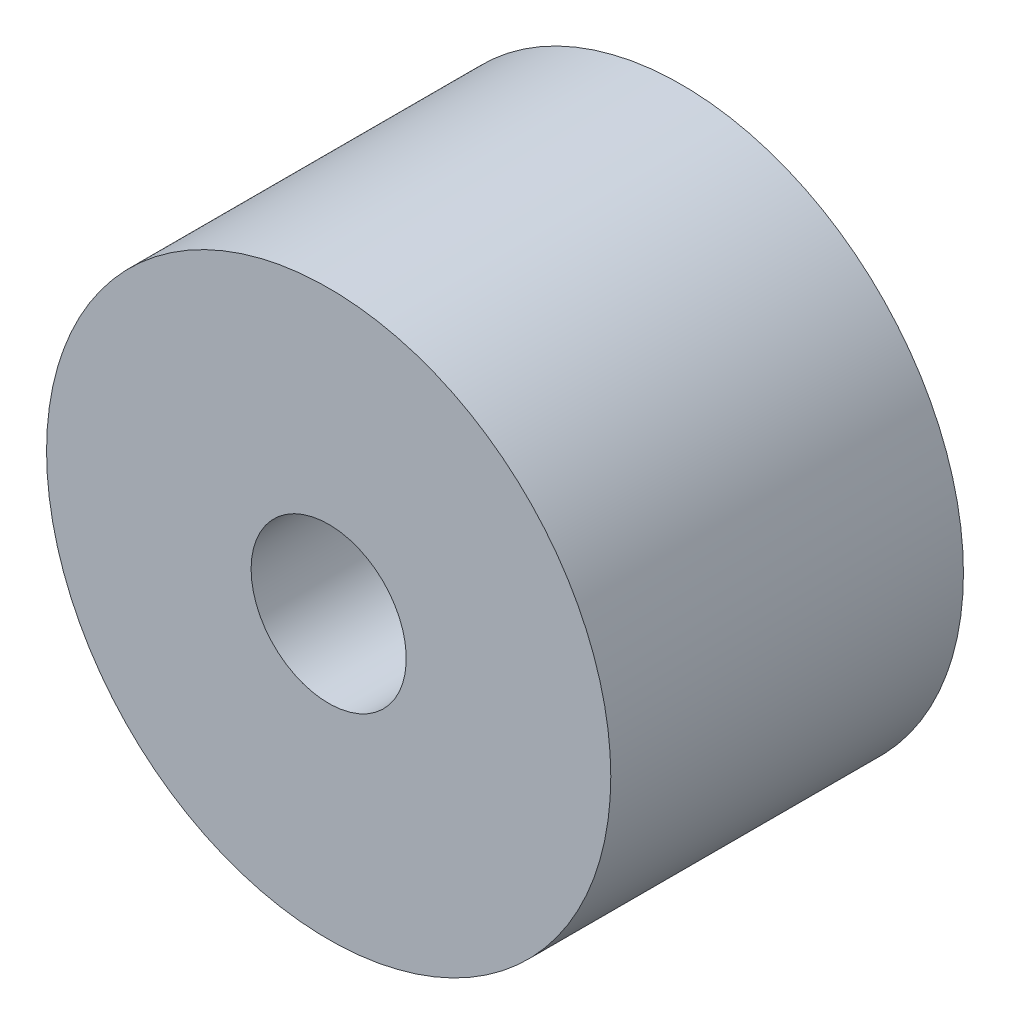
ISO-10303-21;
HEADER;
FILE_DESCRIPTION(('STEP AP214'),'2;1');
FILE_NAME('part.step','',(''),(''),'','','');
FILE_SCHEMA(('AUTOMOTIVE_DESIGN { 1 0 10303 214 1 1 1 1 }'));
ENDSEC;
DATA;
#1=APPLICATION_CONTEXT('core data for automotive mechanical design processes');
#2=APPLICATION_PROTOCOL_DEFINITION('international standard','automotive_design',2000,#1);
#3=PRODUCT_CONTEXT('',#1,'mechanical');
#4=PRODUCT('Part','Part','',(#3));
#5=PRODUCT_RELATED_PRODUCT_CATEGORY('part','',(#4));
#6=PRODUCT_DEFINITION_FORMATION('','',#4);
#7=PRODUCT_DEFINITION_CONTEXT('part definition',#1,'design');
#8=PRODUCT_DEFINITION('design','',#6,#7);
#9=PRODUCT_DEFINITION_SHAPE('','',#8);
#10=(LENGTH_UNIT() NAMED_UNIT(*) SI_UNIT(.MILLI.,.METRE.));
#11=(NAMED_UNIT(*) PLANE_ANGLE_UNIT() SI_UNIT($,.RADIAN.));
#12=(NAMED_UNIT(*) SI_UNIT($,.STERADIAN.) SOLID_ANGLE_UNIT());
#13=UNCERTAINTY_MEASURE_WITH_UNIT(LENGTH_MEASURE(1.E-05),#10,'distance_accuracy_value','');
#14=(GEOMETRIC_REPRESENTATION_CONTEXT(3) GLOBAL_UNCERTAINTY_ASSIGNED_CONTEXT((#13)) GLOBAL_UNIT_ASSIGNED_CONTEXT((#10,
#11,#12)) REPRESENTATION_CONTEXT('',''));
#15=CARTESIAN_POINT('',(0.,0.,0.));
#16=DIRECTION('',(0.,0.,1.));
#17=DIRECTION('',(1.,0.,0.));
#18=AXIS2_PLACEMENT_3D('',#15,#16,#17);
#19=CARTESIAN_POINT('',(0.,0.,12.7));
#20=DIRECTION('',(0.,0.,1.));
#21=DIRECTION('',(1.,0.,0.));
#22=AXIS2_PLACEMENT_3D('',#19,#20,#21);
#23=PLANE('',#22);
#24=CARTESIAN_POINT('',(0.,0.,12.7));
#25=DIRECTION('',(0.,0.,1.));
#26=DIRECTION('',(1.,0.,0.));
#27=AXIS2_PLACEMENT_3D('',#24,#25,#26);
#28=CIRCLE('',#27,10.16);
#29=CARTESIAN_POINT('',(-10.16,0.,12.7));
#30=VERTEX_POINT('',#29);
#31=EDGE_CURVE('E10',#30,#30,#28,.T.);
#32=ORIENTED_EDGE('',*,*,#31,.T.);
#33=EDGE_LOOP('',(#32));
#34=FACE_BOUND('',#33,.T.);
#35=CARTESIAN_POINT('',(0.,0.,12.7));
#36=DIRECTION('',(0.,0.,1.));
#37=DIRECTION('',(1.,0.,0.));
#38=AXIS2_PLACEMENT_3D('',#35,#36,#37);
#39=CIRCLE('',#38,2.794);
#40=CARTESIAN_POINT('',(-2.794,0.,12.7));
#41=VERTEX_POINT('',#40);
#42=EDGE_CURVE('E42',#41,#41,#39,.T.);
#43=ORIENTED_EDGE('',*,*,#42,.F.);
#44=EDGE_LOOP('',(#43));
#45=FACE_BOUND('',#44,.T.);
#46=ADVANCED_FACE('F31',(#34,#45),#23,.T.);
#47=CARTESIAN_POINT('',(0.,0.,0.));
#48=DIRECTION('',(0.,0.,1.));
#49=DIRECTION('',(1.,0.,0.));
#50=AXIS2_PLACEMENT_3D('',#47,#48,#49);
#51=PLANE('',#50);
#52=CARTESIAN_POINT('',(0.,0.,0.));
#53=DIRECTION('',(0.,0.,1.));
#54=DIRECTION('',(1.,0.,0.));
#55=AXIS2_PLACEMENT_3D('',#52,#53,#54);
#56=CIRCLE('',#55,10.16);
#57=CARTESIAN_POINT('',(-10.16,0.,0.));
#58=VERTEX_POINT('',#57);
#59=EDGE_CURVE('E35',#58,#58,#56,.T.);
#60=ORIENTED_EDGE('',*,*,#59,.F.);
#61=EDGE_LOOP('',(#60));
#62=FACE_BOUND('',#61,.T.);
#63=CARTESIAN_POINT('',(0.,0.,0.));
#64=DIRECTION('',(0.,0.,1.));
#65=DIRECTION('',(1.,0.,0.));
#66=AXIS2_PLACEMENT_3D('',#63,#64,#65);
#67=CIRCLE('',#66,2.794);
#68=CARTESIAN_POINT('',(-2.794,0.,0.));
#69=VERTEX_POINT('',#68);
#70=EDGE_CURVE('E44',#69,#69,#67,.T.);
#71=ORIENTED_EDGE('',*,*,#70,.T.);
#72=EDGE_LOOP('',(#71));
#73=FACE_BOUND('',#72,.T.);
#74=ADVANCED_FACE('F54',(#62,#73),#51,.F.);
#75=CARTESIAN_POINT('',(0.,0.,12.7));
#76=DIRECTION('',(0.,0.,-1.));
#77=DIRECTION('',(-1.,0.,0.));
#78=AXIS2_PLACEMENT_3D('',#75,#76,#77);
#79=CYLINDRICAL_SURFACE('',#78,10.16);
#80=CARTESIAN_POINT('',(-10.16,0.,12.7));
#81=CARTESIAN_POINT('',(-10.16,0.,12.5677083333333));
#82=CARTESIAN_POINT('',(-10.16,0.,12.4354166666667));
#83=CARTESIAN_POINT('',(-10.16,0.,12.1708333333333));
#84=CARTESIAN_POINT('',(-10.16,0.,12.0385416666667));
#85=CARTESIAN_POINT('',(-10.16,0.,11.7739583333333));
#86=CARTESIAN_POINT('',(-10.16,0.,11.6416666666667));
#87=CARTESIAN_POINT('',(-10.16,0.,11.3770833333333));
#88=CARTESIAN_POINT('',(-10.16,0.,11.2447916666667));
#89=CARTESIAN_POINT('',(-10.16,0.,10.9802083333333));
#90=CARTESIAN_POINT('',(-10.16,0.,10.8479166666667));
#91=CARTESIAN_POINT('',(-10.16,0.,10.5833333333333));
#92=CARTESIAN_POINT('',(-10.16,0.,10.4510416666667));
#93=CARTESIAN_POINT('',(-10.16,0.,10.1864583333333));
#94=CARTESIAN_POINT('',(-10.16,0.,10.0541666666667));
#95=CARTESIAN_POINT('',(-10.16,0.,9.78958333333333));
#96=CARTESIAN_POINT('',(-10.16,0.,9.65729166666667));
#97=CARTESIAN_POINT('',(-10.16,0.,9.39270833333333));
#98=CARTESIAN_POINT('',(-10.16,0.,9.26041666666667));
#99=CARTESIAN_POINT('',(-10.16,0.,8.99583333333334));
#100=CARTESIAN_POINT('',(-10.16,0.,8.86354166666667));
#101=CARTESIAN_POINT('',(-10.16,0.,8.59895833333334));
#102=CARTESIAN_POINT('',(-10.16,0.,8.46666666666667));
#103=CARTESIAN_POINT('',(-10.16,0.,8.20208333333333));
#104=CARTESIAN_POINT('',(-10.16,0.,8.06979166666667));
#105=CARTESIAN_POINT('',(-10.16,0.,7.80520833333333));
#106=CARTESIAN_POINT('',(-10.16,0.,7.67291666666667));
#107=CARTESIAN_POINT('',(-10.16,0.,7.40833333333333));
#108=CARTESIAN_POINT('',(-10.16,0.,7.27604166666667));
#109=CARTESIAN_POINT('',(-10.16,0.,7.01145833333333));
#110=CARTESIAN_POINT('',(-10.16,0.,6.87916666666667));
#111=CARTESIAN_POINT('',(-10.16,0.,6.61458333333333));
#112=CARTESIAN_POINT('',(-10.16,0.,6.48229166666667));
#113=CARTESIAN_POINT('',(-10.16,0.,6.21770833333333));
#114=CARTESIAN_POINT('',(-10.16,0.,6.08541666666667));
#115=CARTESIAN_POINT('',(-10.16,0.,5.82083333333333));
#116=CARTESIAN_POINT('',(-10.16,0.,5.68854166666667));
#117=CARTESIAN_POINT('',(-10.16,0.,5.42395833333333));
#118=CARTESIAN_POINT('',(-10.16,0.,5.29166666666667));
#119=CARTESIAN_POINT('',(-10.16,0.,5.02708333333333));
#120=CARTESIAN_POINT('',(-10.16,0.,4.89479166666667));
#121=CARTESIAN_POINT('',(-10.16,0.,4.63020833333333));
#122=CARTESIAN_POINT('',(-10.16,0.,4.49791666666667));
#123=CARTESIAN_POINT('',(-10.16,0.,4.23333333333333));
#124=CARTESIAN_POINT('',(-10.16,0.,4.10104166666667));
#125=CARTESIAN_POINT('',(-10.16,0.,3.83645833333333));
#126=CARTESIAN_POINT('',(-10.16,0.,3.70416666666667));
#127=CARTESIAN_POINT('',(-10.16,0.,3.43958333333333));
#128=CARTESIAN_POINT('',(-10.16,0.,3.30729166666667));
#129=CARTESIAN_POINT('',(-10.16,0.,3.04270833333333));
#130=CARTESIAN_POINT('',(-10.16,0.,2.91041666666667));
#131=CARTESIAN_POINT('',(-10.16,0.,2.64583333333333));
#132=CARTESIAN_POINT('',(-10.16,0.,2.51354166666667));
#133=CARTESIAN_POINT('',(-10.16,0.,2.24895833333333));
#134=CARTESIAN_POINT('',(-10.16,0.,2.11666666666667));
#135=CARTESIAN_POINT('',(-10.16,0.,1.85208333333333));
#136=CARTESIAN_POINT('',(-10.16,0.,1.71979166666667));
#137=CARTESIAN_POINT('',(-10.16,0.,1.45520833333333));
#138=CARTESIAN_POINT('',(-10.16,0.,1.32291666666667));
#139=CARTESIAN_POINT('',(-10.16,0.,1.05833333333333));
#140=CARTESIAN_POINT('',(-10.16,0.,0.926041666666666));
#141=CARTESIAN_POINT('',(-10.16,0.,0.661458333333333));
#142=CARTESIAN_POINT('',(-10.16,0.,0.529166666666666));
#143=CARTESIAN_POINT('',(-10.16,0.,0.264583333333333));
#144=CARTESIAN_POINT('',(-10.16,0.,0.132291666666667));
#145=CARTESIAN_POINT('',(-10.16,0.,0.));
#146=B_SPLINE_CURVE_WITH_KNOTS('',3,(#80,#81,#82,#83,#84,#85,#86,#87,#88,#89,#90,#91,#92,#93,
#94,#95,#96,#97,#98,#99,#100,#101,#102,#103,#104,#105,#106,#107,#108,#109,#110,#111,#112,#113,
#114,#115,#116,#117,#118,#119,#120,#121,#122,#123,#124,#125,#126,#127,#128,#129,#130,#131,#132,
#133,#134,#135,#136,#137,#138,#139,#140,#141,#142,#143,#144,#145),.UNSPECIFIED.,.F.,.F.,(4,2,2,
2,2,2,2,2,2,2,2,2,2,2,2,2,2,2,2,2,2,2,2,2,2,2,2,2,2,2,2,2,4),(0.,0.396875,0.793749999999999,
1.190625,1.5875,1.984375,2.38125,2.778125,3.175,3.571875,3.96875,4.365625,4.7625,5.159375,
5.55625,5.953125,6.35,6.746875,7.14375,7.540625,7.9375,8.334375,8.73125,9.128125,9.525,9.921875,
10.31875,10.715625,11.1125,11.509375,11.90625,12.303125,12.7),.UNSPECIFIED.);
#147=EDGE_CURVE('BSEAM33',#30,#58,#146,.T.);
#148=ORIENTED_EDGE('',*,*,#31,.F.);
#149=ORIENTED_EDGE('',*,*,#59,.T.);
#150=ORIENTED_EDGE('',*,*,#147,.T.);
#151=ORIENTED_EDGE('',*,*,#147,.F.);
#152=EDGE_LOOP('',(#148,#150,#149,#151));
#153=FACE_BOUND('',#152,.T.);
#154=ADVANCED_FACE('F33',(#153),#79,.T.);
#155=CARTESIAN_POINT('',(0.,0.,12.7));
#156=DIRECTION('',(0.,0.,-1.));
#157=DIRECTION('',(-1.,0.,0.));
#158=AXIS2_PLACEMENT_3D('',#155,#156,#157);
#159=CYLINDRICAL_SURFACE('',#158,2.794);
#160=CARTESIAN_POINT('',(-2.794,0.,12.7));
#161=CARTESIAN_POINT('',(-2.794,0.,12.5677083333333));
#162=CARTESIAN_POINT('',(-2.794,0.,12.4354166666667));
#163=CARTESIAN_POINT('',(-2.794,0.,12.1708333333333));
#164=CARTESIAN_POINT('',(-2.794,0.,12.0385416666667));
#165=CARTESIAN_POINT('',(-2.794,0.,11.7739583333333));
#166=CARTESIAN_POINT('',(-2.794,0.,11.6416666666667));
#167=CARTESIAN_POINT('',(-2.794,0.,11.3770833333333));
#168=CARTESIAN_POINT('',(-2.794,0.,11.2447916666667));
#169=CARTESIAN_POINT('',(-2.794,0.,10.9802083333333));
#170=CARTESIAN_POINT('',(-2.794,0.,10.8479166666667));
#171=CARTESIAN_POINT('',(-2.794,0.,10.5833333333333));
#172=CARTESIAN_POINT('',(-2.794,0.,10.4510416666667));
#173=CARTESIAN_POINT('',(-2.794,0.,10.1864583333333));
#174=CARTESIAN_POINT('',(-2.794,0.,10.0541666666667));
#175=CARTESIAN_POINT('',(-2.794,0.,9.78958333333333));
#176=CARTESIAN_POINT('',(-2.794,0.,9.65729166666667));
#177=CARTESIAN_POINT('',(-2.794,0.,9.39270833333333));
#178=CARTESIAN_POINT('',(-2.794,0.,9.26041666666667));
#179=CARTESIAN_POINT('',(-2.794,0.,8.99583333333333));
#180=CARTESIAN_POINT('',(-2.794,0.,8.86354166666667));
#181=CARTESIAN_POINT('',(-2.794,0.,8.59895833333333));
#182=CARTESIAN_POINT('',(-2.794,0.,8.46666666666667));
#183=CARTESIAN_POINT('',(-2.794,0.,8.20208333333333));
#184=CARTESIAN_POINT('',(-2.794,0.,8.06979166666667));
#185=CARTESIAN_POINT('',(-2.794,0.,7.80520833333333));
#186=CARTESIAN_POINT('',(-2.794,0.,7.67291666666667));
#187=CARTESIAN_POINT('',(-2.794,0.,7.40833333333333));
#188=CARTESIAN_POINT('',(-2.794,0.,7.27604166666667));
#189=CARTESIAN_POINT('',(-2.794,0.,7.01145833333333));
#190=CARTESIAN_POINT('',(-2.794,0.,6.87916666666667));
#191=CARTESIAN_POINT('',(-2.794,0.,6.61458333333333));
#192=CARTESIAN_POINT('',(-2.794,0.,6.48229166666667));
#193=CARTESIAN_POINT('',(-2.794,0.,6.21770833333333));
#194=CARTESIAN_POINT('',(-2.794,0.,6.08541666666667));
#195=CARTESIAN_POINT('',(-2.794,0.,5.82083333333333));
#196=CARTESIAN_POINT('',(-2.794,0.,5.68854166666667));
#197=CARTESIAN_POINT('',(-2.794,0.,5.42395833333333));
#198=CARTESIAN_POINT('',(-2.794,0.,5.29166666666667));
#199=CARTESIAN_POINT('',(-2.794,0.,5.02708333333333));
#200=CARTESIAN_POINT('',(-2.794,0.,4.89479166666667));
#201=CARTESIAN_POINT('',(-2.794,0.,4.63020833333333));
#202=CARTESIAN_POINT('',(-2.794,0.,4.49791666666667));
#203=CARTESIAN_POINT('',(-2.794,0.,4.23333333333333));
#204=CARTESIAN_POINT('',(-2.794,0.,4.10104166666667));
#205=CARTESIAN_POINT('',(-2.794,0.,3.83645833333333));
#206=CARTESIAN_POINT('',(-2.794,0.,3.70416666666667));
#207=CARTESIAN_POINT('',(-2.794,0.,3.43958333333333));
#208=CARTESIAN_POINT('',(-2.794,0.,3.30729166666667));
#209=CARTESIAN_POINT('',(-2.794,0.,3.04270833333333));
#210=CARTESIAN_POINT('',(-2.794,0.,2.91041666666667));
#211=CARTESIAN_POINT('',(-2.794,0.,2.64583333333333));
#212=CARTESIAN_POINT('',(-2.794,0.,2.51354166666667));
#213=CARTESIAN_POINT('',(-2.794,0.,2.24895833333333));
#214=CARTESIAN_POINT('',(-2.794,0.,2.11666666666667));
#215=CARTESIAN_POINT('',(-2.794,0.,1.85208333333333));
#216=CARTESIAN_POINT('',(-2.794,0.,1.71979166666667));
#217=CARTESIAN_POINT('',(-2.794,0.,1.45520833333333));
#218=CARTESIAN_POINT('',(-2.794,0.,1.32291666666667));
#219=CARTESIAN_POINT('',(-2.794,0.,1.05833333333333));
#220=CARTESIAN_POINT('',(-2.794,0.,0.926041666666666));
#221=CARTESIAN_POINT('',(-2.794,0.,0.661458333333333));
#222=CARTESIAN_POINT('',(-2.794,0.,0.529166666666666));
#223=CARTESIAN_POINT('',(-2.794,0.,0.264583333333333));
#224=CARTESIAN_POINT('',(-2.794,0.,0.132291666666667));
#225=CARTESIAN_POINT('',(-2.794,0.,0.));
#226=B_SPLINE_CURVE_WITH_KNOTS('',3,(#160,#161,#162,#163,#164,#165,#166,#167,#168,#169,#170,
#171,#172,#173,#174,#175,#176,#177,#178,#179,#180,#181,#182,#183,#184,#185,#186,#187,#188,#189,
#190,#191,#192,#193,#194,#195,#196,#197,#198,#199,#200,#201,#202,#203,#204,#205,#206,#207,#208,
#209,#210,#211,#212,#213,#214,#215,#216,#217,#218,#219,#220,#221,#222,#223,#224,#225),
.UNSPECIFIED.,.F.,.F.,(4,2,2,2,2,2,2,2,2,2,2,2,2,2,2,2,2,2,2,2,2,2,2,2,2,2,2,2,2,2,2,2,4),(0.,
0.396875000000001,0.793750000000001,1.190625,1.5875,1.984375,2.38125,2.778125,3.175,3.571875,
3.96875,4.365625,4.7625,5.159375,5.55625,5.953125,6.35,6.746875,7.14375,7.540625,7.9375,
8.334375,8.73125,9.128125,9.525,9.921875,10.31875,10.715625,11.1125,11.509375,11.90625,
12.303125,12.7),.UNSPECIFIED.);
#227=EDGE_CURVE('BSEAM50',#41,#69,#226,.T.);
#228=ORIENTED_EDGE('',*,*,#42,.T.);
#229=ORIENTED_EDGE('',*,*,#70,.F.);
#230=ORIENTED_EDGE('',*,*,#227,.T.);
#231=ORIENTED_EDGE('',*,*,#227,.F.);
#232=EDGE_LOOP('',(#228,#230,#229,#231));
#233=FACE_BOUND('',#232,.T.);
#234=ADVANCED_FACE('F50',(#233),#159,.F.);
#235=CLOSED_SHELL('',(#46,#74,#154,#234));
#236=MANIFOLD_SOLID_BREP('B2',#235);
#237=ADVANCED_BREP_SHAPE_REPRESENTATION('',(#18,#236),#14);
#238=SHAPE_DEFINITION_REPRESENTATION(#9,#237);
ENDSEC;
END-ISO-10303-21;
